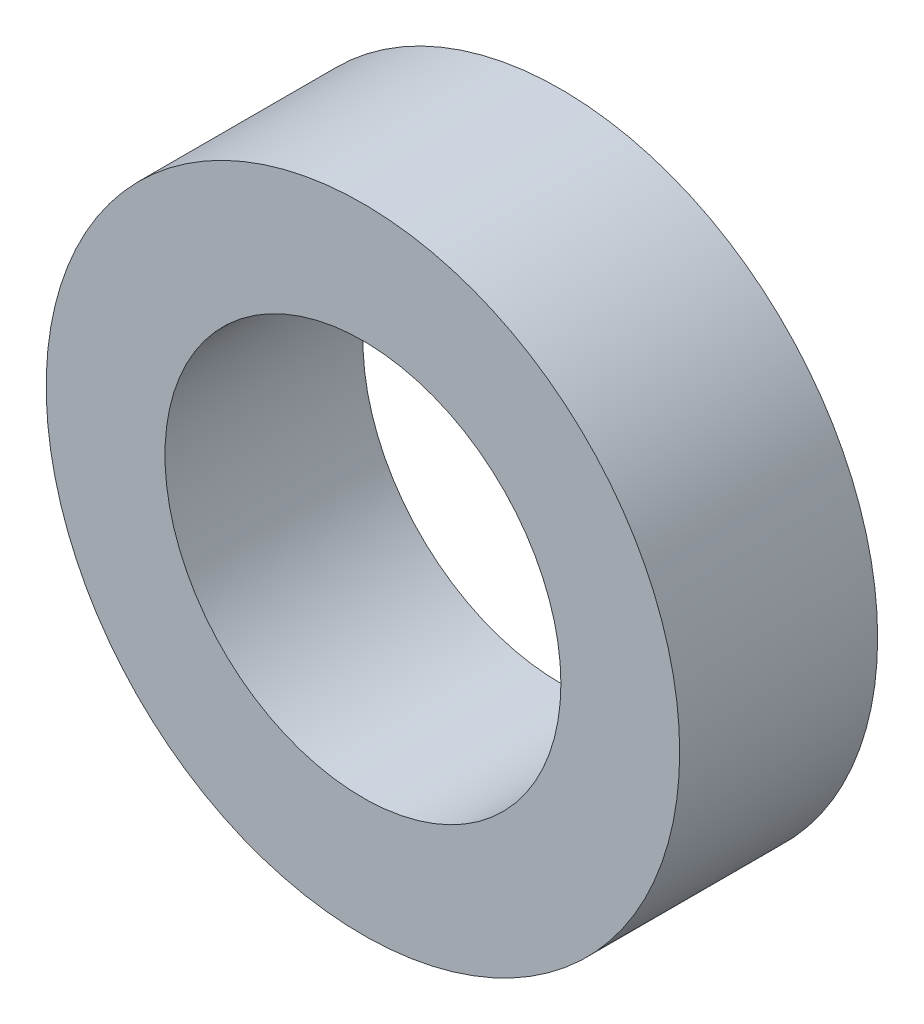
ISO-10303-21;
HEADER;
FILE_DESCRIPTION(('STEP AP214'),'2;1');
FILE_NAME('part.step','',(''),(''),'','','');
FILE_SCHEMA(('AUTOMOTIVE_DESIGN { 1 0 10303 214 1 1 1 1 }'));
ENDSEC;
DATA;
#1=APPLICATION_CONTEXT('core data for automotive mechanical design processes');
#2=APPLICATION_PROTOCOL_DEFINITION('international standard','automotive_design',2000,#1);
#3=PRODUCT_CONTEXT('',#1,'mechanical');
#4=PRODUCT('Part','Part','',(#3));
#5=PRODUCT_RELATED_PRODUCT_CATEGORY('part','',(#4));
#6=PRODUCT_DEFINITION_FORMATION('','',#4);
#7=PRODUCT_DEFINITION_CONTEXT('part definition',#1,'design');
#8=PRODUCT_DEFINITION('design','',#6,#7);
#9=PRODUCT_DEFINITION_SHAPE('','',#8);
#10=(LENGTH_UNIT() NAMED_UNIT(*) SI_UNIT(.MILLI.,.METRE.));
#11=(NAMED_UNIT(*) PLANE_ANGLE_UNIT() SI_UNIT($,.RADIAN.));
#12=(NAMED_UNIT(*) SI_UNIT($,.STERADIAN.) SOLID_ANGLE_UNIT());
#13=UNCERTAINTY_MEASURE_WITH_UNIT(LENGTH_MEASURE(1.E-05),#10,'distance_accuracy_value','');
#14=(GEOMETRIC_REPRESENTATION_CONTEXT(3) GLOBAL_UNCERTAINTY_ASSIGNED_CONTEXT((#13)) GLOBAL_UNIT_ASSIGNED_CONTEXT((#10,
#11,#12)) REPRESENTATION_CONTEXT('',''));
#15=CARTESIAN_POINT('',(0.,0.,0.));
#16=DIRECTION('',(0.,0.,1.));
#17=DIRECTION('',(1.,0.,0.));
#18=AXIS2_PLACEMENT_3D('',#15,#16,#17);
#19=CARTESIAN_POINT('',(0.,0.,2.5));
#20=DIRECTION('',(0.,0.,-1.));
#21=DIRECTION('',(-1.,0.,0.));
#22=AXIS2_PLACEMENT_3D('',#19,#20,#21);
#23=CYLINDRICAL_SURFACE('',#22,2.5);
#24=CARTESIAN_POINT('',(0.,0.,2.5));
#25=DIRECTION('',(0.,0.,1.));
#26=DIRECTION('',(1.,0.,0.));
#27=AXIS2_PLACEMENT_3D('',#24,#25,#26);
#28=CIRCLE('',#27,2.5);
#29=CARTESIAN_POINT('',(2.5,0.,2.5));
#30=VERTEX_POINT('',#29);
#31=EDGE_CURVE('E51',#30,#30,#28,.T.);
#32=ORIENTED_EDGE('',*,*,#31,.T.);
#33=EDGE_LOOP('',(#32));
#34=FACE_BOUND('',#33,.T.);
#35=CARTESIAN_POINT('',(0.,0.,0.));
#36=DIRECTION('',(0.,0.,1.));
#37=DIRECTION('',(1.,0.,0.));
#38=AXIS2_PLACEMENT_3D('',#35,#36,#37);
#39=CIRCLE('',#38,2.5);
#40=CARTESIAN_POINT('',(2.5,0.,0.));
#41=VERTEX_POINT('',#40);
#42=EDGE_CURVE('E58',#41,#41,#39,.T.);
#43=ORIENTED_EDGE('',*,*,#42,.F.);
#44=EDGE_LOOP('',(#43));
#45=FACE_BOUND('',#44,.T.);
#46=ADVANCED_FACE('F43',(#34,#45),#23,.F.);
#47=CARTESIAN_POINT('',(0.,0.,2.5));
#48=DIRECTION('',(0.,0.,-1.));
#49=DIRECTION('',(-1.,0.,0.));
#50=AXIS2_PLACEMENT_3D('',#47,#48,#49);
#51=CYLINDRICAL_SURFACE('',#50,4.);
#52=CARTESIAN_POINT('',(0.,0.,2.5));
#53=DIRECTION('',(0.,0.,1.));
#54=DIRECTION('',(1.,0.,0.));
#55=AXIS2_PLACEMENT_3D('',#52,#53,#54);
#56=CIRCLE('',#55,4.);
#57=CARTESIAN_POINT('',(4.,0.,2.5));
#58=VERTEX_POINT('',#57);
#59=EDGE_CURVE('E10',#58,#58,#56,.T.);
#60=ORIENTED_EDGE('',*,*,#59,.F.);
#61=EDGE_LOOP('',(#60));
#62=FACE_BOUND('',#61,.T.);
#63=CARTESIAN_POINT('',(0.,0.,0.));
#64=DIRECTION('',(0.,0.,1.));
#65=DIRECTION('',(1.,0.,0.));
#66=AXIS2_PLACEMENT_3D('',#63,#64,#65);
#67=CIRCLE('',#66,4.);
#68=CARTESIAN_POINT('',(4.,0.,0.));
#69=VERTEX_POINT('',#68);
#70=EDGE_CURVE('E46',#69,#69,#67,.T.);
#71=ORIENTED_EDGE('',*,*,#70,.T.);
#72=EDGE_LOOP('',(#71));
#73=FACE_BOUND('',#72,.T.);
#74=ADVANCED_FACE('F67',(#62,#73),#51,.T.);
#75=CARTESIAN_POINT('',(0.,0.,2.5));
#76=DIRECTION('',(0.,0.,1.));
#77=DIRECTION('',(1.,0.,0.));
#78=AXIS2_PLACEMENT_3D('',#75,#76,#77);
#79=PLANE('',#78);
#80=ORIENTED_EDGE('',*,*,#31,.F.);
#81=EDGE_LOOP('',(#80));
#82=FACE_BOUND('',#81,.T.);
#83=ORIENTED_EDGE('',*,*,#59,.T.);
#84=EDGE_LOOP('',(#83));
#85=FACE_BOUND('',#84,.T.);
#86=ADVANCED_FACE('F71',(#82,#85),#79,.T.);
#87=CARTESIAN_POINT('',(0.,0.,0.));
#88=DIRECTION('',(0.,0.,1.));
#89=DIRECTION('',(1.,0.,0.));
#90=AXIS2_PLACEMENT_3D('',#87,#88,#89);
#91=PLANE('',#90);
#92=ORIENTED_EDGE('',*,*,#42,.T.);
#93=EDGE_LOOP('',(#92));
#94=FACE_BOUND('',#93,.T.);
#95=ORIENTED_EDGE('',*,*,#70,.F.);
#96=EDGE_LOOP('',(#95));
#97=FACE_BOUND('',#96,.T.);
#98=ADVANCED_FACE('F69',(#94,#97),#91,.F.);
#99=CLOSED_SHELL('',(#46,#74,#86,#98));
#100=MANIFOLD_SOLID_BREP('B2',#99);
#101=ADVANCED_BREP_SHAPE_REPRESENTATION('',(#18,#100),#14);
#102=SHAPE_DEFINITION_REPRESENTATION(#9,#101);
ENDSEC;
END-ISO-10303-21;
